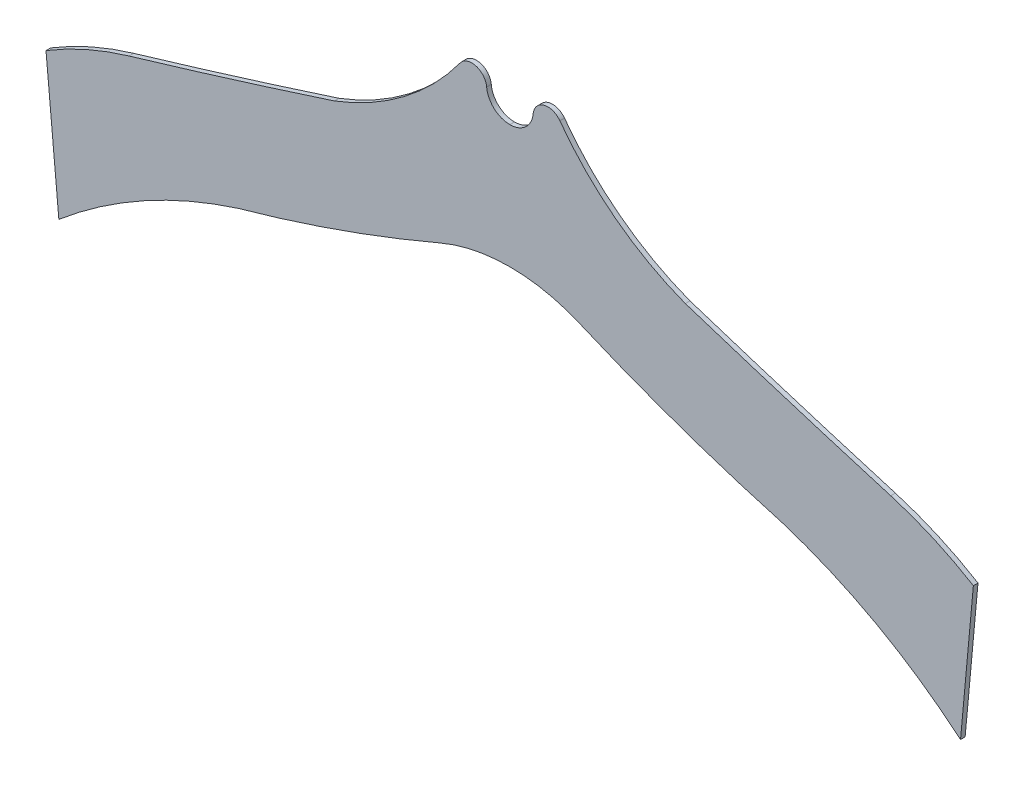
ISO-10303-21;
HEADER;
FILE_DESCRIPTION(('STEP AP214'),'2;1');
FILE_NAME('part.step','',(''),(''),'','','');
FILE_SCHEMA(('AUTOMOTIVE_DESIGN { 1 0 10303 214 1 1 1 1 }'));
ENDSEC;
DATA;
#1=APPLICATION_CONTEXT('core data for automotive mechanical design processes');
#2=APPLICATION_PROTOCOL_DEFINITION('international standard','automotive_design',2000,#1);
#3=PRODUCT_CONTEXT('',#1,'mechanical');
#4=PRODUCT('Part','Part','',(#3));
#5=PRODUCT_RELATED_PRODUCT_CATEGORY('part','',(#4));
#6=PRODUCT_DEFINITION_FORMATION('','',#4);
#7=PRODUCT_DEFINITION_CONTEXT('part definition',#1,'design');
#8=PRODUCT_DEFINITION('design','',#6,#7);
#9=PRODUCT_DEFINITION_SHAPE('','',#8);
#10=(LENGTH_UNIT() NAMED_UNIT(*) SI_UNIT(.MILLI.,.METRE.));
#11=(NAMED_UNIT(*) PLANE_ANGLE_UNIT() SI_UNIT($,.RADIAN.));
#12=(NAMED_UNIT(*) SI_UNIT($,.STERADIAN.) SOLID_ANGLE_UNIT());
#13=UNCERTAINTY_MEASURE_WITH_UNIT(LENGTH_MEASURE(1.E-05),#10,'distance_accuracy_value','');
#14=(GEOMETRIC_REPRESENTATION_CONTEXT(3) GLOBAL_UNCERTAINTY_ASSIGNED_CONTEXT((#13)) GLOBAL_UNIT_ASSIGNED_CONTEXT((#10,
#11,#12)) REPRESENTATION_CONTEXT('',''));
#15=CARTESIAN_POINT('',(0.,0.,0.));
#16=DIRECTION('',(0.,0.,1.));
#17=DIRECTION('',(1.,0.,0.));
#18=AXIS2_PLACEMENT_3D('',#15,#16,#17);
#19=CARTESIAN_POINT('',(-739.962312354849,864.313923100061,0.));
#20=DIRECTION('',(-0.995795754844476,-0.0916013899115097,0.));
#21=DIRECTION('',(0.0916013899115097,-0.995795754844476,0.));
#22=AXIS2_PLACEMENT_3D('',#19,#20,#21);
#23=PLANE('',#22);
#24=DIRECTION('',(0.,0.,-1.));
#25=VECTOR('',#24,1.);
#26=CARTESIAN_POINT('',(-618.70012513447,-453.923402489224,6.35));
#27=LINE('',#26,#25);
#28=CARTESIAN_POINT('',(-618.70012513447,-453.923402489224,6.35));
#29=VERTEX_POINT('',#28);
#30=CARTESIAN_POINT('',(-618.70012513447,-453.923402489224,0.));
#31=VERTEX_POINT('',#30);
#32=EDGE_CURVE('E289',#29,#31,#27,.T.);
#33=ORIENTED_EDGE('',*,*,#32,.F.);
#34=DIRECTION('',(0.0916013899115097,-0.995795754844476,0.));
#35=VECTOR('',#34,1.);
#36=CARTESIAN_POINT('',(-456.655661603026,-2215.50353829879,6.35));
#37=LINE('',#36,#35);
#38=CARTESIAN_POINT('',(-636.348651364475,-262.066843150134,6.35));
#39=VERTEX_POINT('',#38);
#40=EDGE_CURVE('E292',#39,#29,#37,.T.);
#41=ORIENTED_EDGE('',*,*,#40,.F.);
#42=DIRECTION('',(0.,0.,-1.));
#43=VECTOR('',#42,1.);
#44=CARTESIAN_POINT('',(-636.348651364475,-262.066843150134,6.35));
#45=LINE('',#44,#43);
#46=CARTESIAN_POINT('',(-636.348651364475,-262.066843150134,0.));
#47=VERTEX_POINT('',#46);
#48=EDGE_CURVE('E285',#39,#47,#45,.T.);
#49=ORIENTED_EDGE('',*,*,#48,.T.);
#50=DIRECTION('',(0.0916013899115097,-0.995795754844476,0.));
#51=VECTOR('',#50,1.);
#52=CARTESIAN_POINT('',(-456.655661603026,-2215.50353829879,0.));
#53=LINE('',#52,#51);
#54=EDGE_CURVE('E280',#47,#31,#53,.T.);
#55=ORIENTED_EDGE('',*,*,#54,.T.);
#56=EDGE_LOOP('',(#33,#41,#49,#55));
#57=FACE_BOUND('',#56,.T.);
#58=ADVANCED_FACE('F36',(#57),#23,.T.);
#59=CARTESIAN_POINT('',(739.962312354849,864.313923100061,0.));
#60=DIRECTION('',(0.995795754844476,-0.0916013899115097,0.));
#61=DIRECTION('',(-0.0916013899115097,-0.995795754844476,0.));
#62=AXIS2_PLACEMENT_3D('',#59,#60,#61);
#63=PLANE('',#62);
#64=DIRECTION('',(0.,0.,-1.));
#65=VECTOR('',#64,1.);
#66=CARTESIAN_POINT('',(618.743246979862,-453.454626299,6.35));
#67=LINE('',#66,#65);
#68=CARTESIAN_POINT('',(618.743246979862,-453.454626299,0.));
#69=VERTEX_POINT('',#68);
#70=CARTESIAN_POINT('',(618.743246979862,-453.454626299,6.35));
#71=VERTEX_POINT('',#70);
#72=EDGE_CURVE('E288',#69,#71,#67,.F.);
#73=ORIENTED_EDGE('',*,*,#72,.F.);
#74=DIRECTION('',(0.0916013899115097,0.995795754844476,0.));
#75=VECTOR('',#74,1.);
#76=CARTESIAN_POINT('',(453.174620911436,-2253.34581936543,0.));
#77=LINE('',#76,#75);
#78=CARTESIAN_POINT('',(636.380243724969,-261.723403618312,0.));
#79=VERTEX_POINT('',#78);
#80=EDGE_CURVE('E284',#69,#79,#77,.T.);
#81=ORIENTED_EDGE('',*,*,#80,.T.);
#82=DIRECTION('',(0.,0.,-1.));
#83=VECTOR('',#82,1.);
#84=CARTESIAN_POINT('',(636.380243724969,-261.723403618313,6.35));
#85=LINE('',#84,#83);
#86=CARTESIAN_POINT('',(636.380243724969,-261.723403618312,6.35));
#87=VERTEX_POINT('',#86);
#88=EDGE_CURVE('E283',#79,#87,#85,.F.);
#89=ORIENTED_EDGE('',*,*,#88,.T.);
#90=DIRECTION('',(0.0916013899115097,0.995795754844476,0.));
#91=VECTOR('',#90,1.);
#92=CARTESIAN_POINT('',(453.174620911436,-2253.34581936543,6.35));
#93=LINE('',#92,#91);
#94=EDGE_CURVE('E40',#71,#87,#93,.T.);
#95=ORIENTED_EDGE('',*,*,#94,.F.);
#96=EDGE_LOOP('',(#73,#81,#89,#95));
#97=FACE_BOUND('',#96,.T.);
#98=ADVANCED_FACE('F431',(#97),#63,.T.);
#99=CARTESIAN_POINT('',(-156.283159372883,-999.155181900189,6.35));
#100=DIRECTION('',(0.,0.,-1.));
#101=DIRECTION('',(-1.,0.,0.));
#102=AXIS2_PLACEMENT_3D('',#99,#100,#101);
#103=CYLINDRICAL_SURFACE('',#102,714.917578119185);
#104=CARTESIAN_POINT('',(-156.283159372883,-999.155181900189,6.35));
#105=DIRECTION('',(0.,0.,1.));
#106=DIRECTION('',(1.,0.,0.));
#107=AXIS2_PLACEMENT_3D('',#104,#105,#106);
#108=CIRCLE('',#107,714.917578119185);
#109=CARTESIAN_POINT('',(-372.386738487296,-317.681494515459,6.35));
#110=VERTEX_POINT('',#109);
#111=EDGE_CURVE('E221',#110,#29,#108,.T.);
#112=ORIENTED_EDGE('',*,*,#111,.T.);
#113=ORIENTED_EDGE('',*,*,#32,.T.);
#114=CARTESIAN_POINT('',(-156.283159372883,-999.155181900189,0.));
#115=DIRECTION('',(0.,0.,1.));
#116=DIRECTION('',(1.,0.,0.));
#117=AXIS2_PLACEMENT_3D('',#114,#115,#116);
#118=CIRCLE('',#117,714.917578119185);
#119=CARTESIAN_POINT('',(-372.386738487296,-317.681494515459,0.));
#120=VERTEX_POINT('',#119);
#121=EDGE_CURVE('E271',#120,#31,#118,.T.);
#122=ORIENTED_EDGE('',*,*,#121,.F.);
#123=DIRECTION('',(0.,0.,-1.));
#124=VECTOR('',#123,1.);
#125=CARTESIAN_POINT('',(-372.386738487296,-317.681494515459,6.35));
#126=LINE('',#125,#124);
#127=EDGE_CURVE('E331',#110,#120,#126,.T.);
#128=ORIENTED_EDGE('',*,*,#127,.F.);
#129=EDGE_LOOP('',(#112,#113,#122,#128));
#130=FACE_BOUND('',#129,.T.);
#131=ADVANCED_FACE('F433',(#130),#103,.F.);
#132=CARTESIAN_POINT('',(-972.801689950771,1832.13245827714,6.35));
#133=DIRECTION('',(0.,0.,-1.));
#134=DIRECTION('',(-1.,0.,0.));
#135=AXIS2_PLACEMENT_3D('',#132,#133,#134);
#136=CYLINDRICAL_SURFACE('',#135,2232.08381239653);
#137=CARTESIAN_POINT('',(-972.801689950771,1832.13245827714,0.));
#138=DIRECTION('',(0.,0.,1.));
#139=DIRECTION('',(1.,0.,0.));
#140=AXIS2_PLACEMENT_3D('',#137,#138,#139);
#141=CIRCLE('',#140,2232.08381239653);
#142=CARTESIAN_POINT('',(-95.4768665316326,-220.304946316531,0.));
#143=VERTEX_POINT('',#142);
#144=EDGE_CURVE('E275',#120,#143,#141,.T.);
#145=ORIENTED_EDGE('',*,*,#144,.T.);
#146=DIRECTION('',(0.,0.,-1.));
#147=VECTOR('',#146,1.);
#148=CARTESIAN_POINT('',(-95.4768665316326,-220.304946316531,6.35));
#149=LINE('',#148,#147);
#150=CARTESIAN_POINT('',(-95.4768665316326,-220.304946316531,6.35));
#151=VERTEX_POINT('',#150);
#152=EDGE_CURVE('E334',#151,#143,#149,.T.);
#153=ORIENTED_EDGE('',*,*,#152,.F.);
#154=CARTESIAN_POINT('',(-972.801689950771,1832.13245827714,6.35));
#155=DIRECTION('',(0.,0.,1.));
#156=DIRECTION('',(1.,0.,0.));
#157=AXIS2_PLACEMENT_3D('',#154,#155,#156);
#158=CIRCLE('',#157,2232.08381239653);
#159=EDGE_CURVE('E218',#110,#151,#158,.T.);
#160=ORIENTED_EDGE('',*,*,#159,.F.);
#161=ORIENTED_EDGE('',*,*,#127,.T.);
#162=EDGE_LOOP('',(#145,#153,#160,#161));
#163=FACE_BOUND('',#162,.T.);
#164=ADVANCED_FACE('F439',(#163),#136,.T.);
#165=CARTESIAN_POINT('',(-0.139152994322878,-443.340570193637,6.35));
#166=DIRECTION('',(0.,0.,-1.));
#167=DIRECTION('',(-1.,0.,0.));
#168=AXIS2_PLACEMENT_3D('',#165,#166,#167);
#169=CYLINDRICAL_SURFACE('',#168,242.557558407849);
#170=CARTESIAN_POINT('',(-0.139152994322878,-443.340570193637,0.));
#171=DIRECTION('',(0.,0.,1.));
#172=DIRECTION('',(1.,0.,0.));
#173=AXIS2_PLACEMENT_3D('',#170,#171,#172);
#174=CIRCLE('',#173,242.557558407849);
#175=CARTESIAN_POINT('',(0.298210181422362,-200.78340609777,0.));
#176=VERTEX_POINT('',#175);
#177=EDGE_CURVE('E265',#176,#143,#174,.T.);
#178=ORIENTED_EDGE('',*,*,#177,.F.);
#179=DIRECTION('',(0.,0.,-1.));
#180=VECTOR('',#179,1.);
#181=CARTESIAN_POINT('',(0.298210181422362,-200.78340609777,6.35));
#182=LINE('',#181,#180);
#183=CARTESIAN_POINT('',(0.298210181422362,-200.78340609777,6.35));
#184=VERTEX_POINT('',#183);
#185=EDGE_CURVE('E130',#184,#176,#182,.T.);
#186=ORIENTED_EDGE('',*,*,#185,.F.);
#187=CARTESIAN_POINT('',(-0.139152994322878,-443.340570193637,6.35));
#188=DIRECTION('',(0.,0.,1.));
#189=DIRECTION('',(1.,0.,0.));
#190=AXIS2_PLACEMENT_3D('',#187,#188,#189);
#191=CIRCLE('',#190,242.557558407849);
#192=EDGE_CURVE('E215',#184,#151,#191,.T.);
#193=ORIENTED_EDGE('',*,*,#192,.T.);
#194=ORIENTED_EDGE('',*,*,#152,.T.);
#195=EDGE_LOOP('',(#178,#186,#193,#194));
#196=FACE_BOUND('',#195,.T.);
#197=ADVANCED_FACE('F480',(#196),#169,.F.);
#198=CARTESIAN_POINT('',(0.735573356729802,-443.340570193637,6.35));
#199=DIRECTION('',(0.,0.,-1.));
#200=DIRECTION('',(-1.,0.,0.));
#201=AXIS2_PLACEMENT_3D('',#198,#199,#200);
#202=CYLINDRICAL_SURFACE('',#201,242.557558407857);
#203=CARTESIAN_POINT('',(0.735573356729802,-443.340570193637,0.));
#204=DIRECTION('',(0.,0.,1.));
#205=DIRECTION('',(1.,0.,0.));
#206=AXIS2_PLACEMENT_3D('',#203,#204,#205);
#207=CIRCLE('',#206,242.557558407857);
#208=CARTESIAN_POINT('',(96.0732868940892,-220.304946316558,0.));
#209=VERTEX_POINT('',#208);
#210=EDGE_CURVE('E346',#209,#176,#207,.T.);
#211=ORIENTED_EDGE('',*,*,#210,.F.);
#212=DIRECTION('',(0.,0.,-1.));
#213=VECTOR('',#212,1.);
#214=CARTESIAN_POINT('',(96.0732868940892,-220.304946316558,6.35));
#215=LINE('',#214,#213);
#216=CARTESIAN_POINT('',(96.0732868940892,-220.304946316558,6.35));
#217=VERTEX_POINT('',#216);
#218=EDGE_CURVE('E332',#217,#209,#215,.T.);
#219=ORIENTED_EDGE('',*,*,#218,.F.);
#220=CARTESIAN_POINT('',(0.735573356729802,-443.340570193637,6.35));
#221=DIRECTION('',(0.,0.,1.));
#222=DIRECTION('',(1.,0.,0.));
#223=AXIS2_PLACEMENT_3D('',#220,#221,#222);
#224=CIRCLE('',#223,242.557558407857);
#225=EDGE_CURVE('E225',#217,#184,#224,.T.);
#226=ORIENTED_EDGE('',*,*,#225,.T.);
#227=ORIENTED_EDGE('',*,*,#185,.T.);
#228=EDGE_LOOP('',(#211,#219,#226,#227));
#229=FACE_BOUND('',#228,.T.);
#230=ADVANCED_FACE('F477',(#229),#202,.F.);
#231=CARTESIAN_POINT('',(973.398110312947,1832.13245827724,6.35));
#232=DIRECTION('',(0.,0.,-1.));
#233=DIRECTION('',(-1.,0.,0.));
#234=AXIS2_PLACEMENT_3D('',#231,#232,#233);
#235=CYLINDRICAL_SURFACE('',#234,2232.08381239653);
#236=CARTESIAN_POINT('',(973.398110312947,1832.13245827724,0.));
#237=DIRECTION('',(0.,0.,1.));
#238=DIRECTION('',(1.,0.,0.));
#239=AXIS2_PLACEMENT_3D('',#236,#237,#238);
#240=CIRCLE('',#239,2232.08381239653);
#241=CARTESIAN_POINT('',(372.983158854075,-317.681494516652,0.));
#242=VERTEX_POINT('',#241);
#243=EDGE_CURVE('E299',#209,#242,#240,.T.);
#244=ORIENTED_EDGE('',*,*,#243,.T.);
#245=DIRECTION('',(0.,0.,-1.));
#246=VECTOR('',#245,1.);
#247=CARTESIAN_POINT('',(372.983158854075,-317.681494516652,6.35));
#248=LINE('',#247,#246);
#249=CARTESIAN_POINT('',(372.983158854075,-317.681494516652,6.35));
#250=VERTEX_POINT('',#249);
#251=EDGE_CURVE('E328',#250,#242,#248,.T.);
#252=ORIENTED_EDGE('',*,*,#251,.F.);
#253=CARTESIAN_POINT('',(973.398110312947,1832.13245827724,6.35));
#254=DIRECTION('',(0.,0.,1.));
#255=DIRECTION('',(1.,0.,0.));
#256=AXIS2_PLACEMENT_3D('',#253,#254,#255);
#257=CIRCLE('',#256,2232.08381239653);
#258=EDGE_CURVE('E222',#217,#250,#257,.T.);
#259=ORIENTED_EDGE('',*,*,#258,.F.);
#260=ORIENTED_EDGE('',*,*,#218,.T.);
#261=EDGE_LOOP('',(#244,#252,#259,#260));
#262=FACE_BOUND('',#261,.T.);
#263=ADVANCED_FACE('F329',(#262),#235,.T.);
#264=CARTESIAN_POINT('',(156.879579735399,-999.155181900045,6.35));
#265=DIRECTION('',(0.,0.,-1.));
#266=DIRECTION('',(-1.,0.,0.));
#267=AXIS2_PLACEMENT_3D('',#264,#265,#266);
#268=CYLINDRICAL_SURFACE('',#267,714.917578119179);
#269=CARTESIAN_POINT('',(156.879579735399,-999.155181900045,0.));
#270=DIRECTION('',(0.,0.,1.));
#271=DIRECTION('',(1.,0.,0.));
#272=AXIS2_PLACEMENT_3D('',#269,#270,#271);
#273=CIRCLE('',#272,714.917578119179);
#274=EDGE_CURVE('E274',#69,#242,#273,.T.);
#275=ORIENTED_EDGE('',*,*,#274,.F.);
#276=ORIENTED_EDGE('',*,*,#72,.T.);
#277=CARTESIAN_POINT('',(156.879579735399,-999.155181900045,6.35));
#278=DIRECTION('',(0.,0.,1.));
#279=DIRECTION('',(1.,0.,0.));
#280=AXIS2_PLACEMENT_3D('',#277,#278,#279);
#281=CIRCLE('',#280,714.917578119179);
#282=EDGE_CURVE('E226',#71,#250,#281,.T.);
#283=ORIENTED_EDGE('',*,*,#282,.T.);
#284=ORIENTED_EDGE('',*,*,#251,.T.);
#285=EDGE_LOOP('',(#275,#276,#283,#284));
#286=FACE_BOUND('',#285,.T.);
#287=ADVANCED_FACE('F311',(#286),#268,.F.);
#288=CARTESIAN_POINT('',(385.932813205984,-674.250790038151,6.35));
#289=DIRECTION('',(0.,0.,-1.));
#290=DIRECTION('',(-1.,0.,0.));
#291=AXIS2_PLACEMENT_3D('',#288,#289,#290);
#292=CYLINDRICAL_SURFACE('',#291,482.599999999943);
#293=ORIENTED_EDGE('',*,*,#88,.F.);
#294=CARTESIAN_POINT('',(385.932813205984,-674.250790038151,0.));
#295=DIRECTION('',(0.,0.,1.));
#296=DIRECTION('',(1.,0.,0.));
#297=AXIS2_PLACEMENT_3D('',#294,#295,#296);
#298=CIRCLE('',#297,482.599999999943);
#299=CARTESIAN_POINT('',(522.998290593244,-211.524288842854,0.));
#300=VERTEX_POINT('',#299);
#301=EDGE_CURVE('E270',#79,#300,#298,.T.);
#302=ORIENTED_EDGE('',*,*,#301,.T.);
#303=DIRECTION('',(0.,0.,-1.));
#304=VECTOR('',#303,1.);
#305=CARTESIAN_POINT('',(522.998290593244,-211.524288842854,6.35));
#306=LINE('',#305,#304);
#307=CARTESIAN_POINT('',(522.998290593244,-211.524288842854,6.35));
#308=VERTEX_POINT('',#307);
#309=EDGE_CURVE('E391',#308,#300,#306,.T.);
#310=ORIENTED_EDGE('',*,*,#309,.F.);
#311=CARTESIAN_POINT('',(385.932813205984,-674.250790038151,6.35));
#312=DIRECTION('',(0.,0.,1.));
#313=DIRECTION('',(1.,0.,0.));
#314=AXIS2_PLACEMENT_3D('',#311,#312,#313);
#315=CIRCLE('',#314,482.599999999943);
#316=EDGE_CURVE('E242',#87,#308,#315,.T.);
#317=ORIENTED_EDGE('',*,*,#316,.F.);
#318=EDGE_LOOP('',(#293,#302,#310,#317));
#319=FACE_BOUND('',#318,.T.);
#320=ADVANCED_FACE('F430',(#319),#292,.T.);
#321=CARTESIAN_POINT('',(3750.5490518776,10684.5328341059,6.35));
#322=DIRECTION('',(0.,0.,-1.));
#323=DIRECTION('',(-1.,0.,0.));
#324=AXIS2_PLACEMENT_3D('',#321,#322,#323);
#325=CYLINDRICAL_SURFACE('',#324,11364.0285437529);
#326=CARTESIAN_POINT('',(3750.5490518776,10684.5328341059,0.));
#327=DIRECTION('',(0.,0.,1.));
#328=DIRECTION('',(1.,0.,0.));
#329=AXIS2_PLACEMENT_3D('',#326,#327,#328);
#330=CIRCLE('',#329,11364.0285437529);
#331=CARTESIAN_POINT('',(241.13569586022,-124.036110941244,0.));
#332=VERTEX_POINT('',#331);
#333=EDGE_CURVE('E297',#332,#300,#330,.T.);
#334=ORIENTED_EDGE('',*,*,#333,.F.);
#335=DIRECTION('',(0.,0.,-1.));
#336=VECTOR('',#335,1.);
#337=CARTESIAN_POINT('',(241.13569586022,-124.036110941244,6.35));
#338=LINE('',#337,#336);
#339=CARTESIAN_POINT('',(241.13569586022,-124.036110941244,6.35));
#340=VERTEX_POINT('',#339);
#341=EDGE_CURVE('E394',#340,#332,#338,.T.);
#342=ORIENTED_EDGE('',*,*,#341,.F.);
#343=CARTESIAN_POINT('',(3750.5490518776,10684.5328341059,6.35));
#344=DIRECTION('',(0.,0.,1.));
#345=DIRECTION('',(1.,0.,0.));
#346=AXIS2_PLACEMENT_3D('',#343,#344,#345);
#347=CIRCLE('',#346,11364.0285437529);
#348=EDGE_CURVE('E239',#340,#308,#347,.T.);
#349=ORIENTED_EDGE('',*,*,#348,.T.);
#350=ORIENTED_EDGE('',*,*,#309,.T.);
#351=EDGE_LOOP('',(#334,#342,#349,#350));
#352=FACE_BOUND('',#351,.T.);
#353=ADVANCED_FACE('F421',(#352),#325,.F.);
#354=CARTESIAN_POINT('',(375.836584090965,231.666346514466,6.35));
#355=DIRECTION('',(0.,0.,-1.));
#356=DIRECTION('',(-1.,0.,0.));
#357=AXIS2_PLACEMENT_3D('',#354,#355,#356);
#358=CYLINDRICAL_SURFACE('',#357,380.353214170963);
#359=CARTESIAN_POINT('',(375.836584090965,231.666346514466,0.));
#360=DIRECTION('',(0.,0.,1.));
#361=DIRECTION('',(1.,0.,0.));
#362=AXIS2_PLACEMENT_3D('',#359,#360,#361);
#363=CIRCLE('',#362,380.353214170963);
#364=CARTESIAN_POINT('',(68.8387047076425,7.12042786011743,0.));
#365=VERTEX_POINT('',#364);
#366=EDGE_CURVE('E357',#365,#332,#363,.T.);
#367=ORIENTED_EDGE('',*,*,#366,.F.);
#368=DIRECTION('',(0.,0.,-1.));
#369=VECTOR('',#368,1.);
#370=CARTESIAN_POINT('',(68.8387047076425,7.12042786011743,6.35));
#371=LINE('',#370,#369);
#372=CARTESIAN_POINT('',(68.8387047076425,7.12042786011743,6.35));
#373=VERTEX_POINT('',#372);
#374=EDGE_CURVE('E396',#373,#365,#371,.T.);
#375=ORIENTED_EDGE('',*,*,#374,.F.);
#376=CARTESIAN_POINT('',(375.836584090965,231.666346514466,6.35));
#377=DIRECTION('',(0.,0.,1.));
#378=DIRECTION('',(1.,0.,0.));
#379=AXIS2_PLACEMENT_3D('',#376,#377,#378);
#380=CIRCLE('',#379,380.353214170963);
#381=EDGE_CURVE('E236',#373,#340,#380,.T.);
#382=ORIENTED_EDGE('',*,*,#381,.T.);
#383=ORIENTED_EDGE('',*,*,#341,.T.);
#384=EDGE_LOOP('',(#367,#375,#382,#383));
#385=FACE_BOUND('',#384,.T.);
#386=ADVANCED_FACE('F415',(#385),#358,.F.);
#387=CARTESIAN_POINT('',(52.4376420199575,-4.87571913441975,6.35));
#388=DIRECTION('',(0.,0.,-1.));
#389=DIRECTION('',(-1.,0.,0.));
#390=AXIS2_PLACEMENT_3D('',#387,#388,#389);
#391=CYLINDRICAL_SURFACE('',#390,20.3199999999988);
#392=CARTESIAN_POINT('',(52.4376420199575,-4.87571913441975,0.));
#393=DIRECTION('',(0.,0.,1.));
#394=DIRECTION('',(1.,0.,0.));
#395=AXIS2_PLACEMENT_3D('',#392,#393,#394);
#396=CIRCLE('',#395,20.3199999999988);
#397=CARTESIAN_POINT('',(32.206921373201,-2.97299947222019,0.));
#398=VERTEX_POINT('',#397);
#399=EDGE_CURVE('E354',#365,#398,#396,.T.);
#400=ORIENTED_EDGE('',*,*,#399,.T.);
#401=DIRECTION('',(0.,0.,-1.));
#402=VECTOR('',#401,1.);
#403=CARTESIAN_POINT('',(32.206921373201,-2.97299947222019,6.35));
#404=LINE('',#403,#402);
#405=CARTESIAN_POINT('',(32.206921373201,-2.97299947222019,6.35));
#406=VERTEX_POINT('',#405);
#407=EDGE_CURVE('E398',#406,#398,#404,.T.);
#408=ORIENTED_EDGE('',*,*,#407,.F.);
#409=CARTESIAN_POINT('',(52.4376420199575,-4.87571913441975,6.35));
#410=DIRECTION('',(0.,0.,1.));
#411=DIRECTION('',(1.,0.,0.));
#412=AXIS2_PLACEMENT_3D('',#409,#410,#411);
#413=CIRCLE('',#412,20.3199999999988);
#414=EDGE_CURVE('E234',#373,#406,#413,.T.);
#415=ORIENTED_EDGE('',*,*,#414,.F.);
#416=ORIENTED_EDGE('',*,*,#374,.T.);
#417=EDGE_LOOP('',(#400,#408,#415,#416));
#418=FACE_BOUND('',#417,.T.);
#419=ADVANCED_FACE('F466',(#418),#391,.T.);
#420=CARTESIAN_POINT('',(0.596420362405148,0.,6.35));
#421=DIRECTION('',(0.,0.,-1.));
#422=DIRECTION('',(-1.,0.,0.));
#423=AXIS2_PLACEMENT_3D('',#420,#421,#422);
#424=CYLINDRICAL_SURFACE('',#423,31.7500000002416);
#425=CARTESIAN_POINT('',(0.596420362405148,0.,0.));
#426=DIRECTION('',(0.,0.,1.));
#427=DIRECTION('',(1.,0.,0.));
#428=AXIS2_PLACEMENT_3D('',#425,#426,#427);
#429=CIRCLE('',#428,31.7500000002416);
#430=CARTESIAN_POINT('',(0.369811036952766,-31.7491913003932,0.));
#431=VERTEX_POINT('',#430);
#432=EDGE_CURVE('E351',#431,#398,#429,.T.);
#433=ORIENTED_EDGE('',*,*,#432,.F.);
#434=DIRECTION('',(0.,0.,-1.));
#435=VECTOR('',#434,1.);
#436=CARTESIAN_POINT('',(0.369811036952766,-31.7491913003932,6.35));
#437=LINE('',#436,#435);
#438=CARTESIAN_POINT('',(0.369811036952766,-31.7491913003932,6.35));
#439=VERTEX_POINT('',#438);
#440=EDGE_CURVE('E400',#439,#431,#437,.T.);
#441=ORIENTED_EDGE('',*,*,#440,.F.);
#442=CARTESIAN_POINT('',(0.596420362405148,0.,6.35));
#443=DIRECTION('',(0.,0.,1.));
#444=DIRECTION('',(1.,0.,0.));
#445=AXIS2_PLACEMENT_3D('',#442,#443,#444);
#446=CIRCLE('',#445,31.7500000002416);
#447=EDGE_CURVE('E231',#439,#406,#446,.T.);
#448=ORIENTED_EDGE('',*,*,#447,.T.);
#449=ORIENTED_EDGE('',*,*,#407,.T.);
#450=EDGE_LOOP('',(#433,#441,#448,#449));
#451=FACE_BOUND('',#450,.T.);
#452=ADVANCED_FACE('F409',(#451),#424,.F.);
#453=CARTESIAN_POINT('',(0.143201711414687,0.,6.35));
#454=DIRECTION('',(0.,0.,-1.));
#455=DIRECTION('',(-1.,0.,0.));
#456=AXIS2_PLACEMENT_3D('',#453,#454,#455);
#457=CYLINDRICAL_SURFACE('',#456,31.7500000002417);
#458=CARTESIAN_POINT('',(0.143201711414687,0.,0.));
#459=DIRECTION('',(0.,0.,1.));
#460=DIRECTION('',(1.,0.,0.));
#461=AXIS2_PLACEMENT_3D('',#458,#459,#460);
#462=CIRCLE('',#461,31.7500000002417);
#463=CARTESIAN_POINT('',(0.334097045394429,-31.7494261205902,0.));
#464=VERTEX_POINT('',#463);
#465=EDGE_CURVE('E348',#464,#431,#462,.T.);
#466=ORIENTED_EDGE('',*,*,#465,.F.);
#467=DIRECTION('',(0.,0.,-1.));
#468=VECTOR('',#467,1.);
#469=CARTESIAN_POINT('',(0.334097045394429,-31.7494261205902,6.35));
#470=LINE('',#469,#468);
#471=CARTESIAN_POINT('',(0.334097045394429,-31.7494261205902,6.35));
#472=VERTEX_POINT('',#471);
#473=EDGE_CURVE('E219',#472,#464,#470,.T.);
#474=ORIENTED_EDGE('',*,*,#473,.F.);
#475=CARTESIAN_POINT('',(0.143201711414687,0.,6.35));
#476=DIRECTION('',(0.,0.,1.));
#477=DIRECTION('',(1.,0.,0.));
#478=AXIS2_PLACEMENT_3D('',#475,#476,#477);
#479=CIRCLE('',#478,31.7500000002417);
#480=EDGE_CURVE('E228',#472,#439,#479,.T.);
#481=ORIENTED_EDGE('',*,*,#480,.T.);
#482=ORIENTED_EDGE('',*,*,#440,.T.);
#483=EDGE_LOOP('',(#466,#474,#481,#482));
#484=FACE_BOUND('',#483,.T.);
#485=ADVANCED_FACE('F405',(#484),#457,.F.);
#486=CARTESIAN_POINT('',(0.524992379280498,0.,6.35));
#487=DIRECTION('',(0.,0.,-1.));
#488=DIRECTION('',(-1.,0.,0.));
#489=AXIS2_PLACEMENT_3D('',#486,#487,#488);
#490=CYLINDRICAL_SURFACE('',#489,31.7500000002414);
#491=CARTESIAN_POINT('',(0.524992379280498,0.,0.));
#492=DIRECTION('',(0.,0.,1.));
#493=DIRECTION('',(1.,0.,0.));
#494=AXIS2_PLACEMENT_3D('',#491,#492,#493);
#495=CIRCLE('',#494,31.7500000002414);
#496=CARTESIAN_POINT('',(0.298383053739762,-31.7491913003931,0.));
#497=VERTEX_POINT('',#496);
#498=EDGE_CURVE('E11',#497,#464,#495,.T.);
#499=ORIENTED_EDGE('',*,*,#498,.F.);
#500=DIRECTION('',(0.,0.,-1.));
#501=VECTOR('',#500,1.);
#502=CARTESIAN_POINT('',(0.298383053739762,-31.7491913003931,6.35));
#503=LINE('',#502,#501);
#504=CARTESIAN_POINT('',(0.298383053739762,-31.7491913003931,6.35));
#505=VERTEX_POINT('',#504);
#506=EDGE_CURVE('E55',#505,#497,#503,.T.);
#507=ORIENTED_EDGE('',*,*,#506,.F.);
#508=CARTESIAN_POINT('',(0.524992379280498,0.,6.35));
#509=DIRECTION('',(0.,0.,1.));
#510=DIRECTION('',(1.,0.,0.));
#511=AXIS2_PLACEMENT_3D('',#508,#509,#510);
#512=CIRCLE('',#511,31.7500000002414);
#513=EDGE_CURVE('E263',#505,#472,#512,.T.);
#514=ORIENTED_EDGE('',*,*,#513,.T.);
#515=ORIENTED_EDGE('',*,*,#473,.T.);
#516=EDGE_LOOP('',(#499,#507,#514,#515));
#517=FACE_BOUND('',#516,.T.);
#518=ADVANCED_FACE('F401',(#517),#490,.F.);
#519=CARTESIAN_POINT('',(0.0717737282895925,0.,6.35));
#520=DIRECTION('',(0.,0.,-1.));
#521=DIRECTION('',(-1.,0.,0.));
#522=AXIS2_PLACEMENT_3D('',#519,#520,#521);
#523=CYLINDRICAL_SURFACE('',#522,31.7500000002415);
#524=CARTESIAN_POINT('',(0.0717737282895925,0.,0.));
#525=DIRECTION('',(0.,0.,1.));
#526=DIRECTION('',(1.,0.,0.));
#527=AXIS2_PLACEMENT_3D('',#524,#525,#526);
#528=CIRCLE('',#527,31.7500000002415);
#529=CARTESIAN_POINT('',(0.298210181211906,-31.7491925337973,0.));
#530=VERTEX_POINT('',#529);
#531=EDGE_CURVE('E46',#530,#497,#528,.T.);
#532=ORIENTED_EDGE('',*,*,#531,.F.);
#533=DIRECTION('',(0.,0.,-1.));
#534=VECTOR('',#533,1.);
#535=CARTESIAN_POINT('',(0.298210181211906,-31.7491925337973,6.35));
#536=LINE('',#535,#534);
#537=CARTESIAN_POINT('',(0.298210181211906,-31.7491925337973,6.35));
#538=VERTEX_POINT('',#537);
#539=EDGE_CURVE('E118',#538,#530,#536,.T.);
#540=ORIENTED_EDGE('',*,*,#539,.F.);
#541=CARTESIAN_POINT('',(0.0717737282895925,0.,6.35));
#542=DIRECTION('',(0.,0.,1.));
#543=DIRECTION('',(1.,0.,0.));
#544=AXIS2_PLACEMENT_3D('',#541,#542,#543);
#545=CIRCLE('',#544,31.7500000002415);
#546=EDGE_CURVE('E261',#538,#505,#545,.T.);
#547=ORIENTED_EDGE('',*,*,#546,.T.);
#548=ORIENTED_EDGE('',*,*,#506,.T.);
#549=EDGE_LOOP('',(#532,#540,#547,#548));
#550=FACE_BOUND('',#549,.T.);
#551=ADVANCED_FACE('F516',(#550),#523,.F.);
#552=CARTESIAN_POINT('',(0.524646634117332,0.,6.35));
#553=DIRECTION('',(0.,0.,-1.));
#554=DIRECTION('',(-1.,0.,0.));
#555=AXIS2_PLACEMENT_3D('',#552,#553,#554);
#556=CYLINDRICAL_SURFACE('',#555,31.7500000002415);
#557=CARTESIAN_POINT('',(0.524646634117332,0.,0.));
#558=DIRECTION('',(0.,0.,1.));
#559=DIRECTION('',(1.,0.,0.));
#560=AXIS2_PLACEMENT_3D('',#557,#558,#559);
#561=CIRCLE('',#560,31.7500000002415);
#562=CARTESIAN_POINT('',(0.2980373086645,-31.749191300393,0.));
#563=VERTEX_POINT('',#562);
#564=EDGE_CURVE('E199',#563,#530,#561,.T.);
#565=ORIENTED_EDGE('',*,*,#564,.F.);
#566=DIRECTION('',(0.,0.,-1.));
#567=VECTOR('',#566,1.);
#568=CARTESIAN_POINT('',(0.2980373086645,-31.749191300393,6.35));
#569=LINE('',#568,#567);
#570=CARTESIAN_POINT('',(0.2980373086645,-31.749191300393,6.35));
#571=VERTEX_POINT('',#570);
#572=EDGE_CURVE('E185',#571,#563,#569,.T.);
#573=ORIENTED_EDGE('',*,*,#572,.F.);
#574=CARTESIAN_POINT('',(0.524646634117332,0.,6.35));
#575=DIRECTION('',(0.,0.,1.));
#576=DIRECTION('',(1.,0.,0.));
#577=AXIS2_PLACEMENT_3D('',#574,#575,#576);
#578=CIRCLE('',#577,31.7500000002415);
#579=EDGE_CURVE('E259',#571,#538,#578,.T.);
#580=ORIENTED_EDGE('',*,*,#579,.T.);
#581=ORIENTED_EDGE('',*,*,#539,.T.);
#582=EDGE_LOOP('',(#565,#573,#580,#581));
#583=FACE_BOUND('',#582,.T.);
#584=ADVANCED_FACE('F200',(#583),#556,.F.);
#585=CARTESIAN_POINT('',(0.07142798312465,0.,6.35));
#586=DIRECTION('',(0.,0.,-1.));
#587=DIRECTION('',(-1.,0.,0.));
#588=AXIS2_PLACEMENT_3D('',#585,#586,#587);
#589=CYLINDRICAL_SURFACE('',#588,31.7500000002425);
#590=CARTESIAN_POINT('',(0.07142798312465,0.,0.));
#591=DIRECTION('',(0.,0.,1.));
#592=DIRECTION('',(1.,0.,0.));
#593=AXIS2_PLACEMENT_3D('',#590,#591,#592);
#594=CIRCLE('',#593,31.7500000002425);
#595=CARTESIAN_POINT('',(0.262323317068435,-31.749426120591,0.));
#596=VERTEX_POINT('',#595);
#597=EDGE_CURVE('E189',#596,#563,#594,.T.);
#598=ORIENTED_EDGE('',*,*,#597,.F.);
#599=DIRECTION('',(0.,0.,-1.));
#600=VECTOR('',#599,1.);
#601=CARTESIAN_POINT('',(0.262323317068435,-31.749426120591,6.35));
#602=LINE('',#601,#600);
#603=CARTESIAN_POINT('',(0.262323317068435,-31.749426120591,6.35));
#604=VERTEX_POINT('',#603);
#605=EDGE_CURVE('E196',#604,#596,#602,.T.);
#606=ORIENTED_EDGE('',*,*,#605,.F.);
#607=CARTESIAN_POINT('',(0.07142798312465,0.,6.35));
#608=DIRECTION('',(0.,0.,1.));
#609=DIRECTION('',(1.,0.,0.));
#610=AXIS2_PLACEMENT_3D('',#607,#608,#609);
#611=CIRCLE('',#610,31.7500000002425);
#612=EDGE_CURVE('E192',#604,#571,#611,.T.);
#613=ORIENTED_EDGE('',*,*,#612,.T.);
#614=ORIENTED_EDGE('',*,*,#572,.T.);
#615=EDGE_LOOP('',(#598,#606,#613,#614));
#616=FACE_BOUND('',#615,.T.);
#617=ADVANCED_FACE('F187',(#616),#589,.F.);
#618=CARTESIAN_POINT('',(0.453218650991793,0.,6.35));
#619=DIRECTION('',(0.,0.,-1.));
#620=DIRECTION('',(-1.,0.,0.));
#621=AXIS2_PLACEMENT_3D('',#618,#619,#620);
#622=CYLINDRICAL_SURFACE('',#621,31.7500000002423);
#623=CARTESIAN_POINT('',(0.453218650991793,0.,0.));
#624=DIRECTION('',(0.,0.,1.));
#625=DIRECTION('',(1.,0.,0.));
#626=AXIS2_PLACEMENT_3D('',#623,#624,#625);
#627=CIRCLE('',#626,31.7500000002423);
#628=CARTESIAN_POINT('',(0.22660932550657,-31.7491913003931,0.));
#629=VERTEX_POINT('',#628);
#630=EDGE_CURVE('E208',#629,#596,#627,.T.);
#631=ORIENTED_EDGE('',*,*,#630,.F.);
#632=DIRECTION('',(0.,0.,-1.));
#633=VECTOR('',#632,1.);
#634=CARTESIAN_POINT('',(0.22660932550657,-31.7491913003931,6.35));
#635=LINE('',#634,#633);
#636=CARTESIAN_POINT('',(0.22660932550657,-31.7491913003931,6.35));
#637=VERTEX_POINT('',#636);
#638=EDGE_CURVE('E375',#637,#629,#635,.T.);
#639=ORIENTED_EDGE('',*,*,#638,.F.);
#640=CARTESIAN_POINT('',(0.453218650991793,0.,6.35));
#641=DIRECTION('',(0.,0.,1.));
#642=DIRECTION('',(1.,0.,0.));
#643=AXIS2_PLACEMENT_3D('',#640,#641,#642);
#644=CIRCLE('',#643,31.7500000002423);
#645=EDGE_CURVE('E255',#637,#604,#644,.T.);
#646=ORIENTED_EDGE('',*,*,#645,.T.);
#647=ORIENTED_EDGE('',*,*,#605,.T.);
#648=EDGE_LOOP('',(#631,#639,#646,#647));
#649=FACE_BOUND('',#648,.T.);
#650=ADVANCED_FACE('F380',(#649),#622,.F.);
#651=CARTESIAN_POINT('',(0.,0.,6.35));
#652=DIRECTION('',(0.,0.,-1.));
#653=DIRECTION('',(-1.,0.,0.));
#654=AXIS2_PLACEMENT_3D('',#651,#652,#653);
#655=CYLINDRICAL_SURFACE('',#654,31.7500000002419);
#656=CARTESIAN_POINT('',(0.,0.,0.));
#657=DIRECTION('',(0.,0.,1.));
#658=DIRECTION('',(1.,0.,0.));
#659=AXIS2_PLACEMENT_3D('',#656,#657,#658);
#660=CIRCLE('',#659,31.7500000002419);
#661=CARTESIAN_POINT('',(-31.6105010107959,-2.97299947222196,0.));
#662=VERTEX_POINT('',#661);
#663=EDGE_CURVE('E210',#662,#629,#660,.T.);
#664=ORIENTED_EDGE('',*,*,#663,.F.);
#665=DIRECTION('',(0.,0.,-1.));
#666=VECTOR('',#665,1.);
#667=CARTESIAN_POINT('',(-31.6105010107959,-2.97299947222196,6.35));
#668=LINE('',#667,#666);
#669=CARTESIAN_POINT('',(-31.6105010107959,-2.97299947222196,6.35));
#670=VERTEX_POINT('',#669);
#671=EDGE_CURVE('E373',#670,#662,#668,.T.);
#672=ORIENTED_EDGE('',*,*,#671,.F.);
#673=CARTESIAN_POINT('',(0.,0.,6.35));
#674=DIRECTION('',(0.,0.,1.));
#675=DIRECTION('',(1.,0.,0.));
#676=AXIS2_PLACEMENT_3D('',#673,#674,#675);
#677=CIRCLE('',#676,31.7500000002419);
#678=EDGE_CURVE('E252',#670,#637,#677,.T.);
#679=ORIENTED_EDGE('',*,*,#678,.T.);
#680=ORIENTED_EDGE('',*,*,#638,.T.);
#681=EDGE_LOOP('',(#664,#672,#679,#680));
#682=FACE_BOUND('',#681,.T.);
#683=ADVANCED_FACE('F372',(#682),#655,.F.);
#684=CARTESIAN_POINT('',(-51.8412216575541,-4.87571913442153,6.35));
#685=DIRECTION('',(0.,0.,-1.));
#686=DIRECTION('',(-1.,0.,0.));
#687=AXIS2_PLACEMENT_3D('',#684,#685,#686);
#688=CYLINDRICAL_SURFACE('',#687,20.3199999999991);
#689=CARTESIAN_POINT('',(-51.8412216575541,-4.87571913442153,0.));
#690=DIRECTION('',(0.,0.,1.));
#691=DIRECTION('',(1.,0.,0.));
#692=AXIS2_PLACEMENT_3D('',#689,#690,#691);
#693=CIRCLE('',#692,20.3199999999991);
#694=CARTESIAN_POINT('',(-68.242284345227,7.12042786012954,0.));
#695=VERTEX_POINT('',#694);
#696=EDGE_CURVE('E367',#662,#695,#693,.T.);
#697=ORIENTED_EDGE('',*,*,#696,.T.);
#698=DIRECTION('',(0.,0.,-1.));
#699=VECTOR('',#698,1.);
#700=CARTESIAN_POINT('',(-68.242284345227,7.12042786012954,6.35));
#701=LINE('',#700,#699);
#702=CARTESIAN_POINT('',(-68.242284345227,7.12042786012954,6.35));
#703=VERTEX_POINT('',#702);
#704=EDGE_CURVE('E385',#703,#695,#701,.T.);
#705=ORIENTED_EDGE('',*,*,#704,.F.);
#706=CARTESIAN_POINT('',(-51.8412216575541,-4.87571913442153,6.35));
#707=DIRECTION('',(0.,0.,1.));
#708=DIRECTION('',(1.,0.,0.));
#709=AXIS2_PLACEMENT_3D('',#706,#707,#708);
#710=CIRCLE('',#709,20.3199999999991);
#711=EDGE_CURVE('E250',#670,#703,#710,.T.);
#712=ORIENTED_EDGE('',*,*,#711,.F.);
#713=ORIENTED_EDGE('',*,*,#671,.T.);
#714=EDGE_LOOP('',(#697,#705,#712,#713));
#715=FACE_BOUND('',#714,.T.);
#716=ADVANCED_FACE('F515',(#715),#688,.T.);
#717=CARTESIAN_POINT('',(-375.240163728561,231.666346514466,6.35));
#718=DIRECTION('',(0.,0.,-1.));
#719=DIRECTION('',(-1.,0.,0.));
#720=AXIS2_PLACEMENT_3D('',#717,#718,#719);
#721=CYLINDRICAL_SURFACE('',#720,380.353214170965);
#722=CARTESIAN_POINT('',(-375.240163728561,231.666346514466,0.));
#723=DIRECTION('',(0.,0.,1.));
#724=DIRECTION('',(1.,0.,0.));
#725=AXIS2_PLACEMENT_3D('',#722,#723,#724);
#726=CIRCLE('',#725,380.353214170965);
#727=CARTESIAN_POINT('',(-240.539275497814,-124.036110941245,0.));
#728=VERTEX_POINT('',#727);
#729=EDGE_CURVE('E364',#728,#695,#726,.T.);
#730=ORIENTED_EDGE('',*,*,#729,.F.);
#731=DIRECTION('',(0.,0.,-1.));
#732=VECTOR('',#731,1.);
#733=CARTESIAN_POINT('',(-240.539275497814,-124.036110941245,6.35));
#734=LINE('',#733,#732);
#735=CARTESIAN_POINT('',(-240.539275497814,-124.036110941245,6.35));
#736=VERTEX_POINT('',#735);
#737=EDGE_CURVE('E387',#736,#728,#734,.T.);
#738=ORIENTED_EDGE('',*,*,#737,.F.);
#739=CARTESIAN_POINT('',(-375.240163728561,231.666346514466,6.35));
#740=DIRECTION('',(0.,0.,1.));
#741=DIRECTION('',(1.,0.,0.));
#742=AXIS2_PLACEMENT_3D('',#739,#740,#741);
#743=CIRCLE('',#742,380.353214170965);
#744=EDGE_CURVE('E246',#736,#703,#743,.T.);
#745=ORIENTED_EDGE('',*,*,#744,.T.);
#746=ORIENTED_EDGE('',*,*,#704,.T.);
#747=EDGE_LOOP('',(#730,#738,#745,#746));
#748=FACE_BOUND('',#747,.T.);
#749=ADVANCED_FACE('F512',(#748),#721,.F.);
#750=CARTESIAN_POINT('',(-3749.9526315152,10684.5328341059,6.35));
#751=DIRECTION('',(0.,0.,-1.));
#752=DIRECTION('',(-1.,0.,0.));
#753=AXIS2_PLACEMENT_3D('',#750,#751,#752);
#754=CYLINDRICAL_SURFACE('',#753,11364.0285437529);
#755=CARTESIAN_POINT('',(-3749.9526315152,10684.5328341059,0.));
#756=DIRECTION('',(0.,0.,1.));
#757=DIRECTION('',(1.,0.,0.));
#758=AXIS2_PLACEMENT_3D('',#755,#756,#757);
#759=CIRCLE('',#758,11364.0285437529);
#760=CARTESIAN_POINT('',(-522.40187023086,-211.524288842863,0.));
#761=VERTEX_POINT('',#760);
#762=EDGE_CURVE('E269',#761,#728,#759,.T.);
#763=ORIENTED_EDGE('',*,*,#762,.F.);
#764=DIRECTION('',(0.,0.,-1.));
#765=VECTOR('',#764,1.);
#766=CARTESIAN_POINT('',(-522.40187023086,-211.524288842863,6.35));
#767=LINE('',#766,#765);
#768=CARTESIAN_POINT('',(-522.40187023086,-211.524288842863,6.35));
#769=VERTEX_POINT('',#768);
#770=EDGE_CURVE('E389',#769,#761,#767,.T.);
#771=ORIENTED_EDGE('',*,*,#770,.F.);
#772=CARTESIAN_POINT('',(-3749.9526315152,10684.5328341059,6.35));
#773=DIRECTION('',(0.,0.,1.));
#774=DIRECTION('',(1.,0.,0.));
#775=AXIS2_PLACEMENT_3D('',#772,#773,#774);
#776=CIRCLE('',#775,11364.0285437529);
#777=EDGE_CURVE('E243',#769,#736,#776,.T.);
#778=ORIENTED_EDGE('',*,*,#777,.T.);
#779=ORIENTED_EDGE('',*,*,#737,.T.);
#780=EDGE_LOOP('',(#763,#771,#778,#779));
#781=FACE_BOUND('',#780,.T.);
#782=ADVANCED_FACE('F454',(#781),#754,.F.);
#783=CARTESIAN_POINT('',(-385.336392843579,-674.250790038151,6.35));
#784=DIRECTION('',(0.,0.,-1.));
#785=DIRECTION('',(-1.,0.,0.));
#786=AXIS2_PLACEMENT_3D('',#783,#784,#785);
#787=CYLINDRICAL_SURFACE('',#786,482.599999999943);
#788=ORIENTED_EDGE('',*,*,#48,.F.);
#789=CARTESIAN_POINT('',(-385.336392843579,-674.250790038151,6.35));
#790=DIRECTION('',(0.,0.,1.));
#791=DIRECTION('',(1.,0.,0.));
#792=AXIS2_PLACEMENT_3D('',#789,#790,#791);
#793=CIRCLE('',#792,482.599999999943);
#794=EDGE_CURVE('E247',#769,#39,#793,.T.);
#795=ORIENTED_EDGE('',*,*,#794,.F.);
#796=ORIENTED_EDGE('',*,*,#770,.T.);
#797=CARTESIAN_POINT('',(-385.336392843579,-674.250790038151,0.));
#798=DIRECTION('',(0.,0.,1.));
#799=DIRECTION('',(1.,0.,0.));
#800=AXIS2_PLACEMENT_3D('',#797,#798,#799);
#801=CIRCLE('',#800,482.599999999943);
#802=EDGE_CURVE('E266',#761,#47,#801,.T.);
#803=ORIENTED_EDGE('',*,*,#802,.T.);
#804=EDGE_LOOP('',(#788,#795,#796,#803));
#805=FACE_BOUND('',#804,.T.);
#806=ADVANCED_FACE('F450',(#805),#787,.T.);
#807=CARTESIAN_POINT('',(-207.431628724102,-2192.57788542269,0.));
#808=DIRECTION('',(0.,0.,1.));
#809=DIRECTION('',(1.,0.,0.));
#810=AXIS2_PLACEMENT_3D('',#807,#808,#809);
#811=PLANE('',#810);
#812=ORIENTED_EDGE('',*,*,#54,.F.);
#813=ORIENTED_EDGE('',*,*,#802,.F.);
#814=ORIENTED_EDGE('',*,*,#762,.T.);
#815=ORIENTED_EDGE('',*,*,#729,.T.);
#816=ORIENTED_EDGE('',*,*,#696,.F.);
#817=ORIENTED_EDGE('',*,*,#663,.T.);
#818=ORIENTED_EDGE('',*,*,#630,.T.);
#819=ORIENTED_EDGE('',*,*,#597,.T.);
#820=ORIENTED_EDGE('',*,*,#564,.T.);
#821=ORIENTED_EDGE('',*,*,#531,.T.);
#822=ORIENTED_EDGE('',*,*,#498,.T.);
#823=ORIENTED_EDGE('',*,*,#465,.T.);
#824=ORIENTED_EDGE('',*,*,#432,.T.);
#825=ORIENTED_EDGE('',*,*,#399,.F.);
#826=ORIENTED_EDGE('',*,*,#366,.T.);
#827=ORIENTED_EDGE('',*,*,#333,.T.);
#828=ORIENTED_EDGE('',*,*,#301,.F.);
#829=ORIENTED_EDGE('',*,*,#80,.F.);
#830=ORIENTED_EDGE('',*,*,#274,.T.);
#831=ORIENTED_EDGE('',*,*,#243,.F.);
#832=ORIENTED_EDGE('',*,*,#210,.T.);
#833=ORIENTED_EDGE('',*,*,#177,.T.);
#834=ORIENTED_EDGE('',*,*,#144,.F.);
#835=ORIENTED_EDGE('',*,*,#121,.T.);
#836=EDGE_LOOP('',(#812,#813,#814,#815,#816,#817,#818,#819,#820,#821,#822,#823,#824,#825,#826,
#827,#828,#829,#830,#831,#832,#833,#834,#835));
#837=FACE_BOUND('',#836,.T.);
#838=ADVANCED_FACE('F205',(#837),#811,.F.);
#839=CARTESIAN_POINT('',(-207.431628724102,-2192.57788542269,6.35));
#840=DIRECTION('',(0.,0.,1.));
#841=DIRECTION('',(1.,0.,0.));
#842=AXIS2_PLACEMENT_3D('',#839,#840,#841);
#843=PLANE('',#842);
#844=ORIENTED_EDGE('',*,*,#794,.T.);
#845=ORIENTED_EDGE('',*,*,#40,.T.);
#846=ORIENTED_EDGE('',*,*,#111,.F.);
#847=ORIENTED_EDGE('',*,*,#159,.T.);
#848=ORIENTED_EDGE('',*,*,#192,.F.);
#849=ORIENTED_EDGE('',*,*,#225,.F.);
#850=ORIENTED_EDGE('',*,*,#258,.T.);
#851=ORIENTED_EDGE('',*,*,#282,.F.);
#852=ORIENTED_EDGE('',*,*,#94,.T.);
#853=ORIENTED_EDGE('',*,*,#316,.T.);
#854=ORIENTED_EDGE('',*,*,#348,.F.);
#855=ORIENTED_EDGE('',*,*,#381,.F.);
#856=ORIENTED_EDGE('',*,*,#414,.T.);
#857=ORIENTED_EDGE('',*,*,#447,.F.);
#858=ORIENTED_EDGE('',*,*,#480,.F.);
#859=ORIENTED_EDGE('',*,*,#513,.F.);
#860=ORIENTED_EDGE('',*,*,#546,.F.);
#861=ORIENTED_EDGE('',*,*,#579,.F.);
#862=ORIENTED_EDGE('',*,*,#612,.F.);
#863=ORIENTED_EDGE('',*,*,#645,.F.);
#864=ORIENTED_EDGE('',*,*,#678,.F.);
#865=ORIENTED_EDGE('',*,*,#711,.T.);
#866=ORIENTED_EDGE('',*,*,#744,.F.);
#867=ORIENTED_EDGE('',*,*,#777,.F.);
#868=EDGE_LOOP('',(#844,#845,#846,#847,#848,#849,#850,#851,#852,#853,#854,#855,#856,#857,#858,
#859,#860,#861,#862,#863,#864,#865,#866,#867));
#869=FACE_BOUND('',#868,.T.);
#870=ADVANCED_FACE('F38',(#869),#843,.T.);
#871=CLOSED_SHELL('',(#58,#98,#131,#164,#197,#230,#263,#287,#320,#353,#386,#419,#452,#485,#518,
#551,#584,#617,#650,#683,#716,#749,#782,#806,#838,#870));
#872=MANIFOLD_SOLID_BREP('B2',#871);
#873=ADVANCED_BREP_SHAPE_REPRESENTATION('',(#18,#872),#14);
#874=SHAPE_DEFINITION_REPRESENTATION(#9,#873);
ENDSEC;
END-ISO-10303-21;
